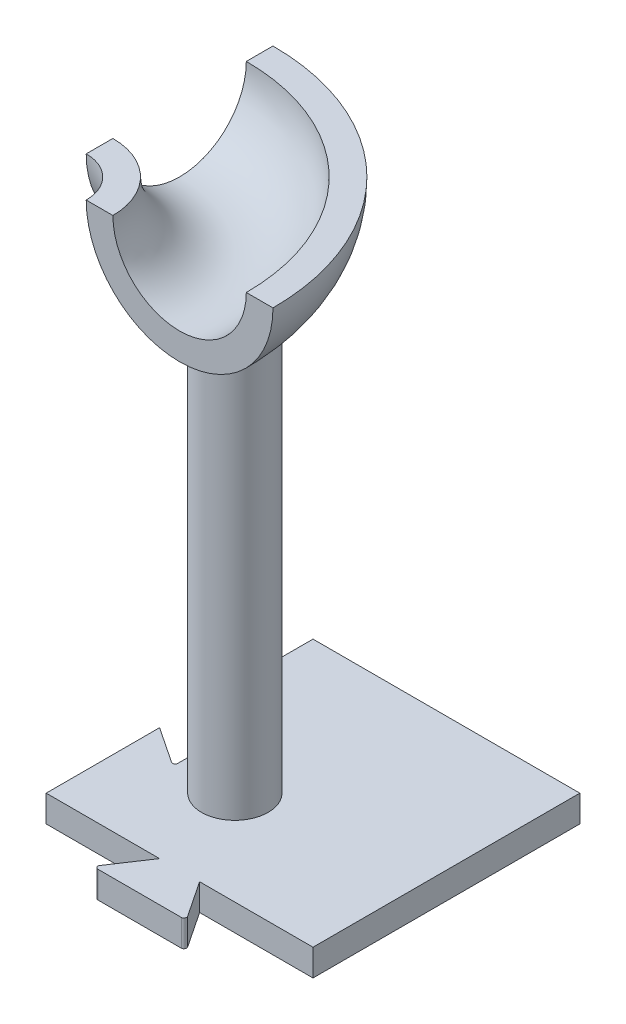
ISO-10303-21;
HEADER;
FILE_DESCRIPTION(('STEP AP214'),'2;1');
FILE_NAME('part.step','',(''),(''),'','','');
FILE_SCHEMA(('AUTOMOTIVE_DESIGN { 1 0 10303 214 1 1 1 1 }'));
ENDSEC;
DATA;
#1=APPLICATION_CONTEXT('core data for automotive mechanical design processes');
#2=APPLICATION_PROTOCOL_DEFINITION('international standard','automotive_design',2000,#1);
#3=PRODUCT_CONTEXT('',#1,'mechanical');
#4=PRODUCT('Part','Part','',(#3));
#5=PRODUCT_RELATED_PRODUCT_CATEGORY('part','',(#4));
#6=PRODUCT_DEFINITION_FORMATION('','',#4);
#7=PRODUCT_DEFINITION_CONTEXT('part definition',#1,'design');
#8=PRODUCT_DEFINITION('design','',#6,#7);
#9=PRODUCT_DEFINITION_SHAPE('','',#8);
#10=(LENGTH_UNIT() NAMED_UNIT(*) SI_UNIT(.MILLI.,.METRE.));
#11=(NAMED_UNIT(*) PLANE_ANGLE_UNIT() SI_UNIT($,.RADIAN.));
#12=(NAMED_UNIT(*) SI_UNIT($,.STERADIAN.) SOLID_ANGLE_UNIT());
#13=UNCERTAINTY_MEASURE_WITH_UNIT(LENGTH_MEASURE(1.E-05),#10,'distance_accuracy_value','');
#14=(GEOMETRIC_REPRESENTATION_CONTEXT(3) GLOBAL_UNCERTAINTY_ASSIGNED_CONTEXT((#13)) GLOBAL_UNIT_ASSIGNED_CONTEXT((#10,
#11,#12)) REPRESENTATION_CONTEXT('',''));
#15=CARTESIAN_POINT('',(0.,0.,0.));
#16=DIRECTION('',(0.,0.,1.));
#17=DIRECTION('',(1.,0.,0.));
#18=AXIS2_PLACEMENT_3D('',#15,#16,#17);
#19=CARTESIAN_POINT('',(-50.,10.,50.));
#20=DIRECTION('',(1.,0.,0.));
#21=DIRECTION('',(0.,0.,-1.));
#22=AXIS2_PLACEMENT_3D('',#19,#20,#21);
#23=PLANE('',#22);
#24=DIRECTION('',(0.,1.,0.));
#25=VECTOR('',#24,1.);
#26=CARTESIAN_POINT('',(-50.,-0.000999999999999265,7.49999999999999));
#27=LINE('',#26,#25);
#28=CARTESIAN_POINT('',(-50.,0.,7.50000000000001));
#29=VERTEX_POINT('',#28);
#30=CARTESIAN_POINT('',(-50.,10.,7.49999999999999));
#31=VERTEX_POINT('',#30);
#32=EDGE_CURVE('E200',#29,#31,#27,.T.);
#33=ORIENTED_EDGE('',*,*,#32,.F.);
#34=DIRECTION('',(0.,0.,1.));
#35=VECTOR('',#34,1.);
#36=CARTESIAN_POINT('',(-50.,0.,50.));
#37=LINE('',#36,#35);
#38=CARTESIAN_POINT('',(-50.,0.,50.));
#39=VERTEX_POINT('',#38);
#40=EDGE_CURVE('E206',#29,#39,#37,.T.);
#41=ORIENTED_EDGE('',*,*,#40,.T.);
#42=DIRECTION('',(0.,-1.,0.));
#43=VECTOR('',#42,1.);
#44=CARTESIAN_POINT('',(-50.,10.,50.));
#45=LINE('',#44,#43);
#46=CARTESIAN_POINT('',(-50.,10.,50.));
#47=VERTEX_POINT('',#46);
#48=EDGE_CURVE('E217',#47,#39,#45,.T.);
#49=ORIENTED_EDGE('',*,*,#48,.F.);
#50=DIRECTION('',(0.,0.,1.));
#51=VECTOR('',#50,1.);
#52=CARTESIAN_POINT('',(-50.,10.,50.));
#53=LINE('',#52,#51);
#54=EDGE_CURVE('E621',#31,#47,#53,.T.);
#55=ORIENTED_EDGE('',*,*,#54,.F.);
#56=EDGE_LOOP('',(#33,#41,#49,#55));
#57=FACE_BOUND('',#56,.T.);
#58=ADVANCED_FACE('F37',(#57),#23,.F.);
#59=CARTESIAN_POINT('',(0.,10.,0.));
#60=DIRECTION('',(0.,-1.,0.));
#61=DIRECTION('',(0.,0.,-1.));
#62=AXIS2_PLACEMENT_3D('',#59,#60,#61);
#63=PLANE('',#62);
#64=CARTESIAN_POINT('',(-14.6446609406726,10.,14.6446609406726));
#65=DIRECTION('',(0.,1.,0.));
#66=DIRECTION('',(0.,0.,1.));
#67=AXIS2_PLACEMENT_3D('',#64,#65,#66);
#68=CIRCLE('',#67,12.5);
#69=CARTESIAN_POINT('',(-14.6446609406726,10.,27.1446609406726));
#70=VERTEX_POINT('',#69);
#71=EDGE_CURVE('E228',#70,#70,#68,.T.);
#72=ORIENTED_EDGE('',*,*,#71,.F.);
#73=EDGE_LOOP('',(#72));
#74=FACE_BOUND('',#73,.T.);
#75=DIRECTION('',(0.832050294337844,0.,0.554700196225229));
#76=VECTOR('',#75,1.);
#77=CARTESIAN_POINT('',(-50.,10.,7.49999999999999));
#78=LINE('',#77,#76);
#79=CARTESIAN_POINT('',(-36.5547001962252,10.,16.4635332025165));
#80=VERTEX_POINT('',#79);
#81=EDGE_CURVE('E187',#31,#80,#78,.T.);
#82=ORIENTED_EDGE('',*,*,#81,.F.);
#83=ORIENTED_EDGE('',*,*,#54,.T.);
#84=DIRECTION('',(1.,0.,0.));
#85=VECTOR('',#84,1.);
#86=CARTESIAN_POINT('',(-50.,10.,50.));
#87=LINE('',#86,#85);
#88=CARTESIAN_POINT('',(-7.49999999999999,10.,50.));
#89=VERTEX_POINT('',#88);
#90=EDGE_CURVE('E218',#47,#89,#87,.T.);
#91=ORIENTED_EDGE('',*,*,#90,.T.);
#92=DIRECTION('',(-0.554700196225229,0.,0.832050294337844));
#93=VECTOR('',#92,1.);
#94=CARTESIAN_POINT('',(-7.49999999999999,10.,50.));
#95=LINE('',#94,#93);
#96=CARTESIAN_POINT('',(-16.4635332025165,10.,63.4452998037748));
#97=VERTEX_POINT('',#96);
#98=EDGE_CURVE('E628',#89,#97,#95,.T.);
#99=ORIENTED_EDGE('',*,*,#98,.T.);
#100=CARTESIAN_POINT('',(-15.6314829081787,10.,64.));
#101=DIRECTION('',(0.,-1.,0.));
#102=DIRECTION('',(0.,0.,-1.));
#103=AXIS2_PLACEMENT_3D('',#100,#101,#102);
#104=CIRCLE('',#103,1.);
#105=CARTESIAN_POINT('',(-15.6314829081787,10.,65.));
#106=VERTEX_POINT('',#105);
#107=EDGE_CURVE('E235',#97,#106,#104,.F.);
#108=ORIENTED_EDGE('',*,*,#107,.T.);
#109=DIRECTION('',(1.,0.,0.));
#110=VECTOR('',#109,1.);
#111=CARTESIAN_POINT('',(-17.5,10.,65.));
#112=LINE('',#111,#110);
#113=CARTESIAN_POINT('',(15.6314829081787,10.,65.));
#114=VERTEX_POINT('',#113);
#115=EDGE_CURVE('E627',#106,#114,#112,.T.);
#116=ORIENTED_EDGE('',*,*,#115,.T.);
#117=CARTESIAN_POINT('',(15.6314829081787,10.,64.));
#118=DIRECTION('',(0.,-1.,0.));
#119=DIRECTION('',(0.,0.,-1.));
#120=AXIS2_PLACEMENT_3D('',#117,#118,#119);
#121=CIRCLE('',#120,1.);
#122=CARTESIAN_POINT('',(16.4635332025165,10.,63.4452998037748));
#123=VERTEX_POINT('',#122);
#124=EDGE_CURVE('E227',#114,#123,#121,.F.);
#125=ORIENTED_EDGE('',*,*,#124,.T.);
#126=DIRECTION('',(-0.554700196225229,0.,-0.832050294337843));
#127=VECTOR('',#126,1.);
#128=CARTESIAN_POINT('',(17.5,10.,65.));
#129=LINE('',#128,#127);
#130=CARTESIAN_POINT('',(7.50000000000001,10.,50.));
#131=VERTEX_POINT('',#130);
#132=EDGE_CURVE('E338',#123,#131,#129,.T.);
#133=ORIENTED_EDGE('',*,*,#132,.T.);
#134=CARTESIAN_POINT('',(50.,10.,50.));
#135=VERTEX_POINT('',#134);
#136=EDGE_CURVE('E614',#131,#135,#87,.T.);
#137=ORIENTED_EDGE('',*,*,#136,.T.);
#138=DIRECTION('',(0.,0.,-1.));
#139=VECTOR('',#138,1.);
#140=CARTESIAN_POINT('',(50.,10.,50.));
#141=LINE('',#140,#139);
#142=CARTESIAN_POINT('',(50.,10.,-50.));
#143=VERTEX_POINT('',#142);
#144=EDGE_CURVE('E212',#135,#143,#141,.T.);
#145=ORIENTED_EDGE('',*,*,#144,.T.);
#146=DIRECTION('',(-1.,0.,0.));
#147=VECTOR('',#146,1.);
#148=CARTESIAN_POINT('',(-50.,10.,-50.));
#149=LINE('',#148,#147);
#150=CARTESIAN_POINT('',(-50.,10.,-50.));
#151=VERTEX_POINT('',#150);
#152=EDGE_CURVE('E624',#143,#151,#149,.T.);
#153=ORIENTED_EDGE('',*,*,#152,.T.);
#154=CARTESIAN_POINT('',(-50.,10.,-7.50000000000001));
#155=VERTEX_POINT('',#154);
#156=EDGE_CURVE('E625',#151,#155,#53,.T.);
#157=ORIENTED_EDGE('',*,*,#156,.T.);
#158=DIRECTION('',(-0.832050294337843,0.,0.554700196225229));
#159=VECTOR('',#158,1.);
#160=CARTESIAN_POINT('',(-35.,10.,-17.5));
#161=LINE('',#160,#159);
#162=CARTESIAN_POINT('',(-36.5547001962252,10.,-16.4635332025165));
#163=VERTEX_POINT('',#162);
#164=EDGE_CURVE('E194',#163,#155,#161,.T.);
#165=ORIENTED_EDGE('',*,*,#164,.F.);
#166=CARTESIAN_POINT('',(-36.,10.,-15.6314829081787));
#167=DIRECTION('',(0.,-1.,0.));
#168=DIRECTION('',(0.,0.,-1.));
#169=AXIS2_PLACEMENT_3D('',#166,#167,#168);
#170=CIRCLE('',#169,1.);
#171=CARTESIAN_POINT('',(-35.,10.,-15.6314829081787));
#172=VERTEX_POINT('',#171);
#173=EDGE_CURVE('E251',#163,#172,#170,.T.);
#174=ORIENTED_EDGE('',*,*,#173,.T.);
#175=DIRECTION('',(0.,0.,-1.));
#176=VECTOR('',#175,1.);
#177=CARTESIAN_POINT('',(-35.,10.,17.5));
#178=LINE('',#177,#176);
#179=CARTESIAN_POINT('',(-35.,10.,15.6314829081787));
#180=VERTEX_POINT('',#179);
#181=EDGE_CURVE('E260',#180,#172,#178,.T.);
#182=ORIENTED_EDGE('',*,*,#181,.F.);
#183=CARTESIAN_POINT('',(-36.,10.,15.6314829081787));
#184=DIRECTION('',(0.,-1.,0.));
#185=DIRECTION('',(0.,0.,-1.));
#186=AXIS2_PLACEMENT_3D('',#183,#184,#185);
#187=CIRCLE('',#186,1.);
#188=EDGE_CURVE('E48',#180,#80,#187,.T.);
#189=ORIENTED_EDGE('',*,*,#188,.T.);
#190=EDGE_LOOP('',(#82,#83,#91,#99,#108,#116,#125,#133,#137,#145,#153,#157,#165,#174,#182,#189));
#191=FACE_BOUND('',#190,.T.);
#192=ADVANCED_FACE('F258',(#74,#191),#63,.F.);
#193=CARTESIAN_POINT('',(0.,0.,0.));
#194=DIRECTION('',(0.,-1.,0.));
#195=DIRECTION('',(0.,0.,-1.));
#196=AXIS2_PLACEMENT_3D('',#193,#194,#195);
#197=PLANE('',#196);
#198=DIRECTION('',(0.832050294337844,0.,0.554700196225229));
#199=VECTOR('',#198,1.);
#200=CARTESIAN_POINT('',(-50.,0.,7.49999999999999));
#201=LINE('',#200,#199);
#202=CARTESIAN_POINT('',(-36.5547001962252,0.,16.4635332025165));
#203=VERTEX_POINT('',#202);
#204=EDGE_CURVE('E196',#29,#203,#201,.T.);
#205=ORIENTED_EDGE('',*,*,#204,.T.);
#206=CARTESIAN_POINT('',(-36.,0.,15.6314829081787));
#207=DIRECTION('',(0.,-1.,0.));
#208=DIRECTION('',(0.,0.,-1.));
#209=AXIS2_PLACEMENT_3D('',#206,#207,#208);
#210=CIRCLE('',#209,1.);
#211=CARTESIAN_POINT('',(-35.,0.,15.6314829081787));
#212=VERTEX_POINT('',#211);
#213=EDGE_CURVE('E11',#203,#212,#210,.F.);
#214=ORIENTED_EDGE('',*,*,#213,.T.);
#215=DIRECTION('',(0.,0.,-1.));
#216=VECTOR('',#215,1.);
#217=CARTESIAN_POINT('',(-35.,0.,17.5));
#218=LINE('',#217,#216);
#219=CARTESIAN_POINT('',(-35.,0.,-15.6314829081787));
#220=VERTEX_POINT('',#219);
#221=EDGE_CURVE('E189',#212,#220,#218,.T.);
#222=ORIENTED_EDGE('',*,*,#221,.T.);
#223=CARTESIAN_POINT('',(-36.,0.,-15.6314829081787));
#224=DIRECTION('',(0.,-1.,0.));
#225=DIRECTION('',(0.,0.,-1.));
#226=AXIS2_PLACEMENT_3D('',#223,#224,#225);
#227=CIRCLE('',#226,1.);
#228=CARTESIAN_POINT('',(-36.5547001962252,0.,-16.4635332025165));
#229=VERTEX_POINT('',#228);
#230=EDGE_CURVE('E181',#220,#229,#227,.F.);
#231=ORIENTED_EDGE('',*,*,#230,.T.);
#232=DIRECTION('',(-0.832050294337844,0.,0.554700196225229));
#233=VECTOR('',#232,1.);
#234=CARTESIAN_POINT('',(-35.,0.,-17.5));
#235=LINE('',#234,#233);
#236=CARTESIAN_POINT('',(-50.,0.,-7.49999999999999));
#237=VERTEX_POINT('',#236);
#238=EDGE_CURVE('E178',#229,#237,#235,.T.);
#239=ORIENTED_EDGE('',*,*,#238,.T.);
#240=CARTESIAN_POINT('',(-50.,0.,-50.));
#241=VERTEX_POINT('',#240);
#242=EDGE_CURVE('E179',#241,#237,#37,.T.);
#243=ORIENTED_EDGE('',*,*,#242,.F.);
#244=DIRECTION('',(-1.,0.,0.));
#245=VECTOR('',#244,1.);
#246=CARTESIAN_POINT('',(-50.,0.,-50.));
#247=LINE('',#246,#245);
#248=CARTESIAN_POINT('',(50.,0.,-50.));
#249=VERTEX_POINT('',#248);
#250=EDGE_CURVE('E209',#249,#241,#247,.T.);
#251=ORIENTED_EDGE('',*,*,#250,.F.);
#252=DIRECTION('',(0.,0.,-1.));
#253=VECTOR('',#252,1.);
#254=CARTESIAN_POINT('',(50.,0.,50.));
#255=LINE('',#254,#253);
#256=CARTESIAN_POINT('',(50.,0.,50.));
#257=VERTEX_POINT('',#256);
#258=EDGE_CURVE('E384',#257,#249,#255,.T.);
#259=ORIENTED_EDGE('',*,*,#258,.F.);
#260=DIRECTION('',(1.,0.,0.));
#261=VECTOR('',#260,1.);
#262=CARTESIAN_POINT('',(-50.,0.,50.));
#263=LINE('',#262,#261);
#264=CARTESIAN_POINT('',(7.50000000000001,0.,50.));
#265=VERTEX_POINT('',#264);
#266=EDGE_CURVE('E202',#265,#257,#263,.T.);
#267=ORIENTED_EDGE('',*,*,#266,.F.);
#268=DIRECTION('',(-0.554700196225229,0.,-0.832050294337843));
#269=VECTOR('',#268,1.);
#270=CARTESIAN_POINT('',(17.5,0.,65.));
#271=LINE('',#270,#269);
#272=CARTESIAN_POINT('',(16.4635332025165,0.,63.4452998037748));
#273=VERTEX_POINT('',#272);
#274=EDGE_CURVE('E324',#273,#265,#271,.T.);
#275=ORIENTED_EDGE('',*,*,#274,.F.);
#276=CARTESIAN_POINT('',(15.6314829081787,0.,64.));
#277=DIRECTION('',(0.,-1.,0.));
#278=DIRECTION('',(0.,0.,-1.));
#279=AXIS2_PLACEMENT_3D('',#276,#277,#278);
#280=CIRCLE('',#279,1.);
#281=CARTESIAN_POINT('',(15.6314829081787,0.,65.));
#282=VERTEX_POINT('',#281);
#283=EDGE_CURVE('E239',#273,#282,#280,.T.);
#284=ORIENTED_EDGE('',*,*,#283,.T.);
#285=DIRECTION('',(1.,0.,0.));
#286=VECTOR('',#285,1.);
#287=CARTESIAN_POINT('',(-17.5,0.,65.));
#288=LINE('',#287,#286);
#289=CARTESIAN_POINT('',(-15.6314829081787,0.,65.));
#290=VERTEX_POINT('',#289);
#291=EDGE_CURVE('E325',#290,#282,#288,.T.);
#292=ORIENTED_EDGE('',*,*,#291,.F.);
#293=CARTESIAN_POINT('',(-15.6314829081787,0.,64.));
#294=DIRECTION('',(0.,-1.,0.));
#295=DIRECTION('',(0.,0.,-1.));
#296=AXIS2_PLACEMENT_3D('',#293,#294,#295);
#297=CIRCLE('',#296,1.);
#298=CARTESIAN_POINT('',(-16.4635332025165,0.,63.4452998037748));
#299=VERTEX_POINT('',#298);
#300=EDGE_CURVE('E241',#290,#299,#297,.T.);
#301=ORIENTED_EDGE('',*,*,#300,.T.);
#302=DIRECTION('',(-0.554700196225229,0.,0.832050294337844));
#303=VECTOR('',#302,1.);
#304=CARTESIAN_POINT('',(-7.49999999999999,0.,50.));
#305=LINE('',#304,#303);
#306=CARTESIAN_POINT('',(-7.49999999999999,0.,50.));
#307=VERTEX_POINT('',#306);
#308=EDGE_CURVE('E332',#307,#299,#305,.T.);
#309=ORIENTED_EDGE('',*,*,#308,.F.);
#310=EDGE_CURVE('E208',#39,#307,#263,.T.);
#311=ORIENTED_EDGE('',*,*,#310,.F.);
#312=ORIENTED_EDGE('',*,*,#40,.F.);
#313=EDGE_LOOP('',(#205,#214,#222,#231,#239,#243,#251,#259,#267,#275,#284,#292,#301,#309,#311,#312));
#314=FACE_BOUND('',#313,.T.);
#315=ADVANCED_FACE('F176',(#314),#197,.T.);
#316=CARTESIAN_POINT('',(-50.,10.,50.));
#317=DIRECTION('',(0.,0.,-1.));
#318=DIRECTION('',(-1.,0.,0.));
#319=AXIS2_PLACEMENT_3D('',#316,#317,#318);
#320=PLANE('',#319);
#321=DIRECTION('',(0.,1.,0.));
#322=VECTOR('',#321,1.);
#323=CARTESIAN_POINT('',(7.50000000000001,-38.0788655293196,50.));
#324=LINE('',#323,#322);
#325=EDGE_CURVE('E334',#265,#131,#324,.T.);
#326=ORIENTED_EDGE('',*,*,#325,.F.);
#327=ORIENTED_EDGE('',*,*,#266,.T.);
#328=DIRECTION('',(0.,-1.,0.));
#329=VECTOR('',#328,1.);
#330=CARTESIAN_POINT('',(50.,10.,50.));
#331=LINE('',#330,#329);
#332=EDGE_CURVE('E214',#135,#257,#331,.T.);
#333=ORIENTED_EDGE('',*,*,#332,.F.);
#334=ORIENTED_EDGE('',*,*,#136,.F.);
#335=EDGE_LOOP('',(#326,#327,#333,#334));
#336=FACE_BOUND('',#335,.T.);
#337=ADVANCED_FACE('F296',(#336),#320,.F.);
#338=CARTESIAN_POINT('',(50.,10.,50.));
#339=DIRECTION('',(-1.,0.,0.));
#340=DIRECTION('',(0.,0.,1.));
#341=AXIS2_PLACEMENT_3D('',#338,#339,#340);
#342=PLANE('',#341);
#343=ORIENTED_EDGE('',*,*,#258,.T.);
#344=DIRECTION('',(0.,-1.,0.));
#345=VECTOR('',#344,1.);
#346=CARTESIAN_POINT('',(50.,10.,-50.));
#347=LINE('',#346,#345);
#348=EDGE_CURVE('E224',#143,#249,#347,.T.);
#349=ORIENTED_EDGE('',*,*,#348,.F.);
#350=ORIENTED_EDGE('',*,*,#144,.F.);
#351=ORIENTED_EDGE('',*,*,#332,.T.);
#352=EDGE_LOOP('',(#343,#349,#350,#351));
#353=FACE_BOUND('',#352,.T.);
#354=ADVANCED_FACE('F299',(#353),#342,.F.);
#355=CARTESIAN_POINT('',(-50.,10.,-50.));
#356=DIRECTION('',(0.,0.,1.));
#357=DIRECTION('',(1.,0.,0.));
#358=AXIS2_PLACEMENT_3D('',#355,#356,#357);
#359=PLANE('',#358);
#360=ORIENTED_EDGE('',*,*,#250,.T.);
#361=DIRECTION('',(0.,-1.,0.));
#362=VECTOR('',#361,1.);
#363=CARTESIAN_POINT('',(-50.,10.,-50.));
#364=LINE('',#363,#362);
#365=EDGE_CURVE('E204',#151,#241,#364,.T.);
#366=ORIENTED_EDGE('',*,*,#365,.F.);
#367=ORIENTED_EDGE('',*,*,#152,.F.);
#368=ORIENTED_EDGE('',*,*,#348,.T.);
#369=EDGE_LOOP('',(#360,#366,#367,#368));
#370=FACE_BOUND('',#369,.T.);
#371=ADVANCED_FACE('F289',(#370),#359,.F.);
#372=ORIENTED_EDGE('',*,*,#242,.T.);
#373=DIRECTION('',(0.,1.,0.));
#374=VECTOR('',#373,1.);
#375=CARTESIAN_POINT('',(-50.,-0.000999999999999265,-7.50000000000001));
#376=LINE('',#375,#374);
#377=EDGE_CURVE('E192',#237,#155,#376,.T.);
#378=ORIENTED_EDGE('',*,*,#377,.T.);
#379=ORIENTED_EDGE('',*,*,#156,.F.);
#380=ORIENTED_EDGE('',*,*,#365,.T.);
#381=EDGE_LOOP('',(#372,#378,#379,#380));
#382=FACE_BOUND('',#381,.T.);
#383=ADVANCED_FACE('F205',(#382),#23,.F.);
#384=ORIENTED_EDGE('',*,*,#310,.T.);
#385=DIRECTION('',(0.,1.,0.));
#386=VECTOR('',#385,1.);
#387=CARTESIAN_POINT('',(-7.49999999999999,-38.0788655293196,50.));
#388=LINE('',#387,#386);
#389=EDGE_CURVE('E343',#307,#89,#388,.T.);
#390=ORIENTED_EDGE('',*,*,#389,.T.);
#391=ORIENTED_EDGE('',*,*,#90,.F.);
#392=ORIENTED_EDGE('',*,*,#48,.T.);
#393=EDGE_LOOP('',(#384,#390,#391,#392));
#394=FACE_BOUND('',#393,.T.);
#395=ADVANCED_FACE('F287',(#394),#320,.F.);
#396=CARTESIAN_POINT('',(-14.6446609406726,210.002,14.6446609406726));
#397=DIRECTION('',(0.,-1.,0.));
#398=DIRECTION('',(0.,0.,-1.));
#399=AXIS2_PLACEMENT_3D('',#396,#397,#398);
#400=CYLINDRICAL_SURFACE('',#399,12.5);
#401=ORIENTED_EDGE('',*,*,#71,.T.);
#402=EDGE_LOOP('',(#401));
#403=FACE_BOUND('',#402,.T.);
#404=CARTESIAN_POINT('',(-23.4171735853589,175.037948119793,5.73999801056576));
#405=CARTESIAN_POINT('',(-23.6549821539822,175.02288081614,5.97427458832228));
#406=CARTESIAN_POINT('',(-23.883518184645,175.012162293418,6.218205165479));
#407=CARTESIAN_POINT('',(-24.3204137703477,174.999933275886,6.7237155227952));
#408=CARTESIAN_POINT('',(-24.5287750837902,174.998421977873,6.98529376142899));
#409=CARTESIAN_POINT('',(-24.9237228674926,175.004918642281,7.5240981204225));
#410=CARTESIAN_POINT('',(-25.1103195397615,175.01292212487,7.80131681828677));
#411=CARTESIAN_POINT('',(-25.4605539106761,175.038519578617,8.3694852223126));
#412=CARTESIAN_POINT('',(-25.6241909417061,175.056113828581,8.66043532742455));
#413=CARTESIAN_POINT('',(-25.9273450778984,175.100706500524,9.25374604095901));
#414=CARTESIAN_POINT('',(-26.0668749854686,175.127699907846,9.55610048836611));
#415=CARTESIAN_POINT('',(-26.3211014853385,175.190654236891,10.1701593228724));
#416=CARTESIAN_POINT('',(-26.4357982563274,175.226615094085,10.4818636426753));
#417=CARTESIAN_POINT('',(-26.639807352454,175.306809103864,11.1124789359798));
#418=CARTESIAN_POINT('',(-26.7291155236524,175.351043608177,11.4313910795811));
#419=CARTESIAN_POINT('',(-26.8819854311357,175.446824219771,12.074241433971));
#420=CARTESIAN_POINT('',(-26.9455466270321,175.498370480485,12.398179750103));
#421=CARTESIAN_POINT('',(-27.0476895029442,175.608562270204,13.0549127159419));
#422=CARTESIAN_POINT('',(-27.0858005580382,175.667318961922,13.3877617824363));
#423=CARTESIAN_POINT('',(-27.1351989005081,175.789672641898,14.0545481371708));
#424=CARTESIAN_POINT('',(-27.1464859476823,175.853269673495,14.3884854351291));
#425=CARTESIAN_POINT('',(-27.1423559857867,175.983625615879,15.0557467915407));
#426=CARTESIAN_POINT('',(-27.1269253755703,176.050386120263,15.3890704511293));
#427=CARTESIAN_POINT('',(-27.0695219125523,176.18513409859,16.0531805911711));
#428=CARTESIAN_POINT('',(-27.0275479126296,176.253121625437,16.3839669613453));
#429=CARTESIAN_POINT('',(-26.9138144834729,176.392495571282,17.061956347245));
#430=CARTESIAN_POINT('',(-26.8403503926615,176.463827376841,17.4088860925371));
#431=CARTESIAN_POINT('',(-26.6639563357701,176.602915447388,18.0961021961565));
#432=CARTESIAN_POINT('',(-26.5610117843221,176.670669922801,18.4363851767789));
#433=CARTESIAN_POINT('',(-26.3260718327317,176.799797545495,19.1079740195827));
#434=CARTESIAN_POINT('',(-26.1940813898387,176.86117177906,19.439281402802));
#435=CARTESIAN_POINT('',(-25.9016549037283,176.974773063654,20.0905219965808));
#436=CARTESIAN_POINT('',(-25.7412353391693,177.02700537903,20.4104616680396));
#437=CARTESIAN_POINT('',(-25.3954968204804,177.119057927835,21.0316663734431));
#438=CARTESIAN_POINT('',(-25.2106183371064,177.159063745298,21.3331485812127));
#439=CARTESIAN_POINT('',(-24.8151782991845,177.225710949246,21.9203637434979));
#440=CARTESIAN_POINT('',(-24.6046172352845,177.252352590995,22.206096998735));
#441=CARTESIAN_POINT('',(-24.1595766426953,177.290786953126,22.7589819874112));
#442=CARTESIAN_POINT('',(-23.9251171451544,177.30259200036,23.0261489718657));
#443=CARTESIAN_POINT('',(-23.434166698731,177.310714321674,23.5396446174646));
#444=CARTESIAN_POINT('',(-23.1776776298105,177.307032916055,23.7859750532067));
#445=CARTESIAN_POINT('',(-22.6721689637157,177.285559707248,24.2316760741475));
#446=CARTESIAN_POINT('',(-22.4250437504837,177.269241403714,24.4332746236219));
#447=CARTESIAN_POINT('',(-21.9168055840414,177.225044284459,24.8165436762202));
#448=CARTESIAN_POINT('',(-21.6556936362394,177.197166298715,24.9982156088754));
#449=CARTESIAN_POINT('',(-21.1212441991256,177.131051137342,25.3406719664219));
#450=CARTESIAN_POINT('',(-20.8479019778667,177.092809922688,25.5014482110784));
#451=CARTESIAN_POINT('',(-20.2908797659775,177.007538848074,25.8012855132398));
#452=CARTESIAN_POINT('',(-20.0071992571925,176.960508547117,25.9403454804739));
#453=CARTESIAN_POINT('',(-19.4248085837365,176.858323377611,26.1990523445776));
#454=CARTESIAN_POINT('',(-19.1259046172602,176.803011439502,26.3182002345909));
#455=CARTESIAN_POINT('',(-18.5206132763084,176.687062324177,26.5328973616781));
#456=CARTESIAN_POINT('',(-18.2142227291971,176.626422860004,26.6284363963765));
#457=CARTESIAN_POINT('',(-17.595538949562,176.501849799096,26.7955879870607));
#458=CARTESIAN_POINT('',(-17.2832438794683,176.437915165806,26.8671929604853));
#459=CARTESIAN_POINT('',(-16.6544651447109,176.308768984244,26.9861777926969));
#460=CARTESIAN_POINT('',(-16.3379830221728,176.243557902076,27.0335663290538));
#461=CARTESIAN_POINT('',(-15.6695447487874,176.107036612744,27.1075649727419));
#462=CARTESIAN_POINT('',(-15.3172815429789,176.035787355978,27.1315432800415));
#463=CARTESIAN_POINT('',(-14.6113723357424,175.896298186678,27.1496023562444));
#464=CARTESIAN_POINT('',(-14.2577262495779,175.828058461802,27.143681263432));
#465=CARTESIAN_POINT('',(-13.5512610527271,175.696675516404,27.1017743246286));
#466=CARTESIAN_POINT('',(-13.198441924165,175.633532184713,27.0657891346356));
#467=CARTESIAN_POINT('',(-12.495997080175,175.514162191288,26.9637190253439));
#468=CARTESIAN_POINT('',(-12.1463712625496,175.457935307481,26.8976350727811));
#469=CARTESIAN_POINT('',(-11.4539618295201,175.354089531356,26.7357909808303));
#470=CARTESIAN_POINT('',(-11.1111596848519,175.306443283961,26.6401278884578));
#471=CARTESIAN_POINT('',(-10.4338800458383,175.220726103405,26.4194715253652));
#472=CARTESIAN_POINT('',(-10.0994026138407,175.182655241941,26.2944780350489));
#473=CARTESIAN_POINT('',(-9.44161294460192,175.116950745694,26.0159325233857));
#474=CARTESIAN_POINT('',(-9.11829719379029,175.089313798707,25.8623895880872));
#475=CARTESIAN_POINT('',(-8.48545896173964,175.044959659927,25.5277819074594));
#476=CARTESIAN_POINT('',(-8.17593573751859,175.028241879271,25.3467186469307));
#477=CARTESIAN_POINT('',(-7.59175275024216,175.006554253414,24.970344625014));
#478=CARTESIAN_POINT('',(-7.31611844255872,175.00092870131,24.7765815290712));
#479=CARTESIAN_POINT('',(-6.78138293373921,174.999283333439,24.367427198037));
#480=CARTESIAN_POINT('',(-6.52228101108029,175.003263098175,24.1520369078786));
#481=CARTESIAN_POINT('',(-6.02248862565808,175.020450344872,23.7012277154507));
#482=CARTESIAN_POINT('',(-5.78179740562708,175.033657447069,23.4658096378049));
#483=CARTESIAN_POINT('',(-5.32047278259373,175.068718185673,22.9766796102884));
#484=CARTESIAN_POINT('',(-5.09983958898116,175.090571912331,22.7229674694919));
#485=CARTESIAN_POINT('',(-4.68216371001142,175.141919206725,22.2017160244485));
#486=CARTESIAN_POINT('',(-4.48490803401855,175.171334548911,21.9343395251184));
#487=CARTESIAN_POINT('',(-4.11264905675943,175.237049053758,21.3853376564954));
#488=CARTESIAN_POINT('',(-3.93764545554099,175.273348123611,21.1037124793427));
#489=CARTESIAN_POINT('',(-3.61084448977178,175.351881746136,20.5280656701834));
#490=CARTESIAN_POINT('',(-3.45904961235355,175.394116934014,20.2340427138863));
#491=CARTESIAN_POINT('',(-3.17947001089717,175.483499033025,19.6355039791562));
#492=CARTESIAN_POINT('',(-3.05168680649605,175.530646254733,19.3309875380596));
#493=CARTESIAN_POINT('',(-2.81605760831697,175.630783054768,18.7007533063694));
#494=CARTESIAN_POINT('',(-2.70923696190867,175.683932465235,18.3746773146125));
#495=CARTESIAN_POINT('',(-2.52284131416227,175.793151533429,17.7153085135024));
#496=CARTESIAN_POINT('',(-2.44326695187541,175.849221259616,17.3820155350723));
#497=CARTESIAN_POINT('',(-2.31175276794194,175.963036380085,16.7102239441482));
#498=CARTESIAN_POINT('',(-2.25981920241179,176.0207821506,16.3717241709901));
#499=CARTESIAN_POINT('',(-2.18388998350914,176.136675213116,15.6916795023969));
#500=CARTESIAN_POINT('',(-2.15989422217781,176.194822503563,15.350134618734));
#501=CARTESIAN_POINT('',(-2.13962709417297,176.31241625789,14.6533504421624));
#502=CARTESIAN_POINT('',(-2.14441996391621,176.371830617022,14.2980742347357));
#503=CARTESIAN_POINT('',(-2.18426813772818,176.488374208259,13.5888349698786));
#504=CARTESIAN_POINT('',(-2.21932429491764,176.545503375898,13.2348719497496));
#505=CARTESIAN_POINT('',(-2.31958561078665,176.65614577129,12.530658360442));
#506=CARTESIAN_POINT('',(-2.38479107596606,176.709658962277,12.1804078290421));
#507=CARTESIAN_POINT('',(-2.54506225516324,176.811800173083,11.4860774059773));
#508=CARTESIAN_POINT('',(-2.64012744224639,176.860428279088,11.1419974055344));
#509=CARTESIAN_POINT('',(-2.85889372795326,176.951316603076,10.4647729591495));
#510=CARTESIAN_POINT('',(-2.98239925697757,176.993617196233,10.1315708089706));
#511=CARTESIAN_POINT('',(-3.25768121234445,177.071197344647,9.47619797742736));
#512=CARTESIAN_POINT('',(-3.40945765466748,177.106476895935,9.15402730229888));
#513=CARTESIAN_POINT('',(-3.74027640945589,177.169117065514,8.5232899591689));
#514=CARTESIAN_POINT('',(-3.91931208008572,177.196479608122,8.21472000084324));
#515=CARTESIAN_POINT('',(-4.30343565290475,177.242589250224,7.61356723777163));
#516=CARTESIAN_POINT('',(-4.50852261567307,177.26133666027,7.3209838570866));
#517=CARTESIAN_POINT('',(-4.93472345767769,177.289169078381,6.76526369018378));
#518=CARTESIAN_POINT('',(-5.1548972752503,177.298603191964,6.50142287310174));
#519=CARTESIAN_POINT('',(-5.61631035729259,177.308831492125,5.99267812048045));
#520=CARTESIAN_POINT('',(-5.85754904873895,177.309625913654,5.7477736701607));
#521=CARTESIAN_POINT('',(-6.3592772678854,177.3025557368,5.27874735279469));
#522=CARTESIAN_POINT('',(-6.6197646847274,177.29469208657,5.05462321299308));
#523=CARTESIAN_POINT('',(-7.15805565191465,177.270501118319,4.62874753537503));
#524=CARTESIAN_POINT('',(-7.43585913132144,177.254173834968,4.42699590591483));
#525=CARTESIAN_POINT('',(-8.00101222311861,177.213859781979,4.05103912094035));
#526=CARTESIAN_POINT('',(-8.28806213540138,177.190031788579,3.87636595243268));
#527=CARTESIAN_POINT('',(-8.87474545101841,177.13517840303,3.55094204512382));
#528=CARTESIAN_POINT('',(-9.17437862863285,177.104153139942,3.40019087743911));
#529=CARTESIAN_POINT('',(-9.78417864569949,177.035601521277,3.12347040212154));
#530=CARTESIAN_POINT('',(-10.0943462575314,176.998074688178,2.99750291623595));
#531=CARTESIAN_POINT('',(-10.7231311339589,176.917344777436,2.77102282763157));
#532=CARTESIAN_POINT('',(-11.0417488754594,176.874141378874,2.67051166499773));
#533=CARTESIAN_POINT('',(-11.6931943661306,176.78187629799,2.49330117796948));
#534=CARTESIAN_POINT('',(-12.0261792538143,176.732697699889,2.41724037170605));
#535=CARTESIAN_POINT('',(-12.6966674860409,176.630437615766,2.29267336415443));
#536=CARTESIAN_POINT('',(-13.0341708820855,176.577356085228,2.24416747720947));
#537=CARTESIAN_POINT('',(-13.711607213291,176.468427022739,2.17488329563196));
#538=CARTESIAN_POINT('',(-14.0515404358445,176.412579158802,2.15410833737223));
#539=CARTESIAN_POINT('',(-14.7317096063467,176.299310848382,2.1403362429342));
#540=CARTESIAN_POINT('',(-15.0719455616631,176.241890362555,2.14733980237964));
#541=CARTESIAN_POINT('',(-15.7635518442185,176.124505730362,2.18983773535775));
#542=CARTESIAN_POINT('',(-16.1148544408869,176.064527782726,2.22640376491751));
#543=CARTESIAN_POINT('',(-16.8132732990059,175.94556943525,2.32915390788263));
#544=CARTESIAN_POINT('',(-17.1603895221179,175.886589044543,2.39533829231983));
#545=CARTESIAN_POINT('',(-17.8483305884216,175.770980096181,2.55700588184327));
#546=CARTESIAN_POINT('',(-18.189152143742,175.714352749302,2.65250396364619));
#547=CARTESIAN_POINT('',(-18.8620066940267,175.604859849397,2.87226685815202));
#548=CARTESIAN_POINT('',(-19.1940397293585,175.551994279091,2.99653153869784));
#549=CARTESIAN_POINT('',(-19.8806801761019,175.446183009786,3.28741458798374));
#550=CARTESIAN_POINT('',(-20.2340889249279,175.393790211447,3.45707753220915));
#551=CARTESIAN_POINT('',(-20.9242866980752,175.29695450238,3.82939082328234));
#552=CARTESIAN_POINT('',(-21.2610738187038,175.25251250074,4.03204493727091));
#553=CARTESIAN_POINT('',(-21.9146872003728,175.173215110583,4.46865486098408));
#554=CARTESIAN_POINT('',(-22.2315231075053,175.13835506148,4.70259537065083));
#555=CARTESIAN_POINT('',(-22.8422758200313,175.079623795493,5.19986796168193));
#556=CARTESIAN_POINT('',(-23.1361969348755,175.055750508231,5.46319449383038));
#557=CARTESIAN_POINT('',(-23.4171735853589,175.037948119793,5.73999801056576));
#558=B_SPLINE_CURVE_WITH_KNOTS('',3,(#404,#405,#406,#407,#408,#409,#410,#411,#412,#413,#414,
#415,#416,#417,#418,#419,#420,#421,#422,#423,#424,#425,#426,#427,#428,#429,#430,#431,#432,#433,
#434,#435,#436,#437,#438,#439,#440,#441,#442,#443,#444,#445,#446,#447,#448,#449,#450,#451,#452,
#453,#454,#455,#456,#457,#458,#459,#460,#461,#462,#463,#464,#465,#466,#467,#468,#469,#470,#471,
#472,#473,#474,#475,#476,#477,#478,#479,#480,#481,#482,#483,#484,#485,#486,#487,#488,#489,#490,
#491,#492,#493,#494,#495,#496,#497,#498,#499,#500,#501,#502,#503,#504,#505,#506,#507,#508,#509,
#510,#511,#512,#513,#514,#515,#516,#517,#518,#519,#520,#521,#522,#523,#524,#525,#526,#527,#528,
#529,#530,#531,#532,#533,#534,#535,#536,#537,#538,#539,#540,#541,#542,#543,#544,#545,#546,#547,
#548,#549,#550,#551,#552,#553,#554,#555,#556,#557),.UNSPECIFIED.,.T.,.F.,(4,2,2,2,2,2,2,2,2,2,2,
2,2,2,2,2,2,2,2,2,2,2,2,2,2,2,2,2,2,2,2,2,2,2,2,2,2,2,2,2,2,2,2,2,2,2,2,2,2,2,2,2,2,2,2,2,2,2,2,
2,2,2,2,2,2,2,2,2,2,2,2,2,2,2,2,2,4),(0.,1.00214438618167,2.00420134796692,3.00578669937641,
4.00740116864332,5.00848207125295,6.00955577025258,7.01079316513165,8.01205157331676,
9.03134731313205,10.05065218043,11.0704760973988,12.0903440909304,13.1742462881813,
14.2586856719496,15.3429401182701,16.4265681307023,17.4928215468699,18.5590545961939,
19.6244011885258,20.6896569563567,21.6465478343747,22.6033700202817,23.5605656614225,
24.5178093433572,25.4962852166797,26.4751831938672,27.4543910028886,28.4332476820983,
29.5125698882788,30.5919593003493,31.6713251607778,32.7506563557184,33.8264832593649,
34.9023182179684,35.9778113692621,37.0532465151957,38.0629372189161,39.0725838265227,
40.08218888306,41.0918044778583,42.0913687013709,43.090919449588,44.0905772383906,
45.090298271672,46.1307814538068,47.1712890384072,48.2120320276317,49.2527709951462,
50.3322142596317,51.4116879545684,52.4911726237475,53.5706382443275,54.6428916025408,
55.7151455668595,56.787138688461,57.8590931644943,58.889138558956,59.9191559420343,
60.9490605382622,61.9789609155714,62.9883803194794,63.9977816240538,65.0072570978996,
66.0167896658468,67.0508728576507,68.0849678459149,69.1191872373528,70.153432527656,
71.2269465207819,72.3004703376273,73.3745398716588,74.4486044713888,75.633327833976,
76.8181865707917,78.002467977892,79.1865261241571),.UNSPECIFIED.);
#559=CARTESIAN_POINT('',(-23.4171735853589,175.037948119793,5.73999801056576));
#560=VERTEX_POINT('',#559);
#561=EDGE_CURVE('E374',#560,#560,#558,.T.);
#562=ORIENTED_EDGE('',*,*,#561,.F.);
#563=EDGE_LOOP('',(#562));
#564=FACE_BOUND('',#563,.T.);
#565=ADVANCED_FACE('F294',(#403,#564),#400,.T.);
#566=CARTESIAN_POINT('',(-50.,210.,50.));
#567=DIRECTION('',(0.,1.,0.));
#568=DIRECTION('',(0.,0.,1.));
#569=AXIS2_PLACEMENT_3D('',#566,#567,#568);
#570=TOROIDAL_SURFACE('',#569,50.,35.);
#571=CARTESIAN_POINT('',(-50.,210.,50.));
#572=DIRECTION('',(0.,1.,0.));
#573=DIRECTION('',(1.,0.,0.));
#574=AXIS2_PLACEMENT_3D('',#571,#572,#573);
#575=CIRCLE('',#574,85.);
#576=CARTESIAN_POINT('',(35.,210.,50.));
#577=VERTEX_POINT('',#576);
#578=CARTESIAN_POINT('',(-50.,210.,-35.));
#579=VERTEX_POINT('',#578);
#580=EDGE_CURVE('E366',#577,#579,#575,.T.);
#581=ORIENTED_EDGE('',*,*,#580,.F.);
#582=CARTESIAN_POINT('',(0.,210.,50.));
#583=DIRECTION('',(0.,0.,1.));
#584=DIRECTION('',(-1.,0.,0.));
#585=AXIS2_PLACEMENT_3D('',#582,#583,#584);
#586=CIRCLE('',#585,35.);
#587=CARTESIAN_POINT('',(-35.,210.,50.));
#588=VERTEX_POINT('',#587);
#589=EDGE_CURVE('E359',#588,#577,#586,.T.);
#590=ORIENTED_EDGE('',*,*,#589,.F.);
#591=CARTESIAN_POINT('',(-50.,210.,50.));
#592=DIRECTION('',(0.,1.,0.));
#593=DIRECTION('',(1.,0.,0.));
#594=AXIS2_PLACEMENT_3D('',#591,#592,#593);
#595=CIRCLE('',#594,15.);
#596=CARTESIAN_POINT('',(-50.,210.,35.));
#597=VERTEX_POINT('',#596);
#598=EDGE_CURVE('E363',#588,#597,#595,.T.);
#599=ORIENTED_EDGE('',*,*,#598,.T.);
#600=CARTESIAN_POINT('',(-50.,210.,0.));
#601=DIRECTION('',(1.,0.,0.));
#602=DIRECTION('',(0.,0.,1.));
#603=AXIS2_PLACEMENT_3D('',#600,#601,#602);
#604=CIRCLE('',#603,35.);
#605=EDGE_CURVE('E365',#597,#579,#604,.T.);
#606=ORIENTED_EDGE('',*,*,#605,.T.);
#607=EDGE_LOOP('',(#581,#590,#599,#606));
#608=FACE_BOUND('',#607,.T.);
#609=ORIENTED_EDGE('',*,*,#561,.T.);
#610=EDGE_LOOP('',(#609));
#611=FACE_BOUND('',#610,.T.);
#612=ADVANCED_FACE('F394',(#608,#611),#570,.T.);
#613=CARTESIAN_POINT('',(0.,210.,50.));
#614=DIRECTION('',(0.,0.,-1.));
#615=DIRECTION('',(-1.,0.,0.));
#616=AXIS2_PLACEMENT_3D('',#613,#614,#615);
#617=PLANE('',#616);
#618=CARTESIAN_POINT('',(0.,210.,50.));
#619=DIRECTION('',(0.,0.,-1.));
#620=DIRECTION('',(-1.,0.,0.));
#621=AXIS2_PLACEMENT_3D('',#618,#619,#620);
#622=CIRCLE('',#621,25.);
#623=CARTESIAN_POINT('',(25.,210.,50.));
#624=VERTEX_POINT('',#623);
#625=CARTESIAN_POINT('',(-25.,210.,50.));
#626=VERTEX_POINT('',#625);
#627=EDGE_CURVE('E341',#624,#626,#622,.T.);
#628=ORIENTED_EDGE('',*,*,#627,.T.);
#629=DIRECTION('',(-1.,0.,0.));
#630=VECTOR('',#629,1.);
#631=CARTESIAN_POINT('',(-25.,210.,50.));
#632=LINE('',#631,#630);
#633=EDGE_CURVE('E347',#626,#588,#632,.T.);
#634=ORIENTED_EDGE('',*,*,#633,.T.);
#635=ORIENTED_EDGE('',*,*,#589,.T.);
#636=DIRECTION('',(-1.,0.,0.));
#637=VECTOR('',#636,1.);
#638=CARTESIAN_POINT('',(25.,210.,50.));
#639=LINE('',#638,#637);
#640=EDGE_CURVE('E357',#577,#624,#639,.T.);
#641=ORIENTED_EDGE('',*,*,#640,.T.);
#642=EDGE_LOOP('',(#628,#634,#635,#641));
#643=FACE_BOUND('',#642,.T.);
#644=ADVANCED_FACE('F388',(#643),#617,.F.);
#645=CARTESIAN_POINT('',(-50.,210.,0.));
#646=DIRECTION('',(-1.,0.,0.));
#647=DIRECTION('',(0.,0.,1.));
#648=AXIS2_PLACEMENT_3D('',#645,#646,#647);
#649=PLANE('',#648);
#650=CARTESIAN_POINT('',(-50.,210.,0.));
#651=DIRECTION('',(-1.,0.,0.));
#652=DIRECTION('',(0.,0.,1.));
#653=AXIS2_PLACEMENT_3D('',#650,#651,#652);
#654=CIRCLE('',#653,25.);
#655=CARTESIAN_POINT('',(-50.,210.,-25.));
#656=VERTEX_POINT('',#655);
#657=CARTESIAN_POINT('',(-50.,210.,25.));
#658=VERTEX_POINT('',#657);
#659=EDGE_CURVE('E350',#656,#658,#654,.T.);
#660=ORIENTED_EDGE('',*,*,#659,.F.);
#661=DIRECTION('',(0.,0.,1.));
#662=VECTOR('',#661,1.);
#663=CARTESIAN_POINT('',(-50.,210.,-25.));
#664=LINE('',#663,#662);
#665=EDGE_CURVE('E371',#579,#656,#664,.T.);
#666=ORIENTED_EDGE('',*,*,#665,.F.);
#667=ORIENTED_EDGE('',*,*,#605,.F.);
#668=DIRECTION('',(0.,0.,1.));
#669=VECTOR('',#668,1.);
#670=CARTESIAN_POINT('',(-50.,210.,25.));
#671=LINE('',#670,#669);
#672=EDGE_CURVE('E354',#658,#597,#671,.T.);
#673=ORIENTED_EDGE('',*,*,#672,.F.);
#674=EDGE_LOOP('',(#660,#666,#667,#673));
#675=FACE_BOUND('',#674,.T.);
#676=ADVANCED_FACE('F391',(#675),#649,.T.);
#677=CARTESIAN_POINT('',(-50.,210.,50.));
#678=DIRECTION('',(0.,1.,0.));
#679=DIRECTION('',(0.,0.,1.));
#680=AXIS2_PLACEMENT_3D('',#677,#678,#679);
#681=TOROIDAL_SURFACE('',#680,50.,25.);
#682=CARTESIAN_POINT('',(-50.,210.,50.));
#683=DIRECTION('',(0.,1.,0.));
#684=DIRECTION('',(1.,0.,0.));
#685=AXIS2_PLACEMENT_3D('',#682,#683,#684);
#686=CIRCLE('',#685,25.);
#687=EDGE_CURVE('E349',#626,#658,#686,.T.);
#688=ORIENTED_EDGE('',*,*,#687,.F.);
#689=ORIENTED_EDGE('',*,*,#627,.F.);
#690=CARTESIAN_POINT('',(-50.,210.,50.));
#691=DIRECTION('',(0.,1.,0.));
#692=DIRECTION('',(1.,0.,0.));
#693=AXIS2_PLACEMENT_3D('',#690,#691,#692);
#694=CIRCLE('',#693,75.);
#695=EDGE_CURVE('E348',#624,#656,#694,.T.);
#696=ORIENTED_EDGE('',*,*,#695,.T.);
#697=ORIENTED_EDGE('',*,*,#659,.T.);
#698=EDGE_LOOP('',(#688,#689,#696,#697));
#699=FACE_BOUND('',#698,.T.);
#700=ADVANCED_FACE('F397',(#699),#681,.F.);
#701=CARTESIAN_POINT('',(-25.,210.,50.));
#702=DIRECTION('',(0.,-1.,0.));
#703=DIRECTION('',(0.,0.,-1.));
#704=AXIS2_PLACEMENT_3D('',#701,#702,#703);
#705=PLANE('',#704);
#706=ORIENTED_EDGE('',*,*,#598,.F.);
#707=ORIENTED_EDGE('',*,*,#633,.F.);
#708=ORIENTED_EDGE('',*,*,#687,.T.);
#709=ORIENTED_EDGE('',*,*,#672,.T.);
#710=EDGE_LOOP('',(#706,#707,#708,#709));
#711=FACE_BOUND('',#710,.T.);
#712=ADVANCED_FACE('F404',(#711),#705,.F.);
#713=CARTESIAN_POINT('',(25.,210.,50.));
#714=DIRECTION('',(0.,-1.,0.));
#715=DIRECTION('',(0.,0.,-1.));
#716=AXIS2_PLACEMENT_3D('',#713,#714,#715);
#717=PLANE('',#716);
#718=ORIENTED_EDGE('',*,*,#665,.T.);
#719=ORIENTED_EDGE('',*,*,#695,.F.);
#720=ORIENTED_EDGE('',*,*,#640,.F.);
#721=ORIENTED_EDGE('',*,*,#580,.T.);
#722=EDGE_LOOP('',(#718,#719,#720,#721));
#723=FACE_BOUND('',#722,.T.);
#724=ADVANCED_FACE('F402',(#723),#717,.F.);
#725=CARTESIAN_POINT('',(-7.49999999999999,-38.0788655293196,50.));
#726=DIRECTION('',(-0.832050294337844,0.,-0.554700196225229));
#727=DIRECTION('',(-0.554700196225229,0.,0.832050294337844));
#728=AXIS2_PLACEMENT_3D('',#725,#726,#727);
#729=PLANE('',#728);
#730=ORIENTED_EDGE('',*,*,#308,.T.);
#731=DIRECTION('',(0.,1.,0.));
#732=VECTOR('',#731,1.);
#733=CARTESIAN_POINT('',(-16.4635332025165,-38.0788655293196,63.4452998037748));
#734=LINE('',#733,#732);
#735=EDGE_CURVE('E230',#299,#97,#734,.T.);
#736=ORIENTED_EDGE('',*,*,#735,.T.);
#737=ORIENTED_EDGE('',*,*,#98,.F.);
#738=ORIENTED_EDGE('',*,*,#389,.F.);
#739=EDGE_LOOP('',(#730,#736,#737,#738));
#740=FACE_BOUND('',#739,.T.);
#741=ADVANCED_FACE('F398',(#740),#729,.T.);
#742=CARTESIAN_POINT('',(-17.5,-38.0788655293196,65.));
#743=DIRECTION('',(0.,0.,1.));
#744=DIRECTION('',(1.,0.,0.));
#745=AXIS2_PLACEMENT_3D('',#742,#743,#744);
#746=PLANE('',#745);
#747=ORIENTED_EDGE('',*,*,#115,.F.);
#748=DIRECTION('',(0.,1.,0.));
#749=VECTOR('',#748,1.);
#750=CARTESIAN_POINT('',(-15.6314829081787,-38.0788655293196,65.));
#751=LINE('',#750,#749);
#752=EDGE_CURVE('E240',#106,#290,#751,.F.);
#753=ORIENTED_EDGE('',*,*,#752,.T.);
#754=ORIENTED_EDGE('',*,*,#291,.T.);
#755=DIRECTION('',(0.,1.,0.));
#756=VECTOR('',#755,1.);
#757=CARTESIAN_POINT('',(15.6314829081787,-38.0788655293196,65.));
#758=LINE('',#757,#756);
#759=EDGE_CURVE('E232',#282,#114,#758,.T.);
#760=ORIENTED_EDGE('',*,*,#759,.T.);
#761=EDGE_LOOP('',(#747,#753,#754,#760));
#762=FACE_BOUND('',#761,.T.);
#763=ADVANCED_FACE('F327',(#762),#746,.T.);
#764=CARTESIAN_POINT('',(17.5,-38.0788655293196,65.));
#765=DIRECTION('',(0.832050294337843,0.,-0.554700196225229));
#766=DIRECTION('',(-0.554700196225229,0.,-0.832050294337843));
#767=AXIS2_PLACEMENT_3D('',#764,#765,#766);
#768=PLANE('',#767);
#769=ORIENTED_EDGE('',*,*,#132,.F.);
#770=DIRECTION('',(0.,1.,0.));
#771=VECTOR('',#770,1.);
#772=CARTESIAN_POINT('',(16.4635332025165,-38.0788655293196,63.4452998037748));
#773=LINE('',#772,#771);
#774=EDGE_CURVE('E244',#123,#273,#773,.F.);
#775=ORIENTED_EDGE('',*,*,#774,.T.);
#776=ORIENTED_EDGE('',*,*,#274,.T.);
#777=ORIENTED_EDGE('',*,*,#325,.T.);
#778=EDGE_LOOP('',(#769,#775,#776,#777));
#779=FACE_BOUND('',#778,.T.);
#780=ADVANCED_FACE('F309',(#779),#768,.T.);
#781=CARTESIAN_POINT('',(-15.6314829081787,-38.0788655293196,64.));
#782=DIRECTION('',(0.,1.,0.));
#783=DIRECTION('',(0.,0.,1.));
#784=AXIS2_PLACEMENT_3D('',#781,#782,#783);
#785=CYLINDRICAL_SURFACE('',#784,1.);
#786=ORIENTED_EDGE('',*,*,#300,.F.);
#787=ORIENTED_EDGE('',*,*,#752,.F.);
#788=ORIENTED_EDGE('',*,*,#107,.F.);
#789=ORIENTED_EDGE('',*,*,#735,.F.);
#790=EDGE_LOOP('',(#786,#787,#788,#789));
#791=FACE_BOUND('',#790,.T.);
#792=ADVANCED_FACE('F307',(#791),#785,.T.);
#793=CARTESIAN_POINT('',(15.6314829081787,-38.0788655293196,64.));
#794=DIRECTION('',(0.,1.,0.));
#795=DIRECTION('',(0.,0.,1.));
#796=AXIS2_PLACEMENT_3D('',#793,#794,#795);
#797=CYLINDRICAL_SURFACE('',#796,1.);
#798=ORIENTED_EDGE('',*,*,#283,.F.);
#799=ORIENTED_EDGE('',*,*,#774,.F.);
#800=ORIENTED_EDGE('',*,*,#124,.F.);
#801=ORIENTED_EDGE('',*,*,#759,.F.);
#802=EDGE_LOOP('',(#798,#799,#800,#801));
#803=FACE_BOUND('',#802,.T.);
#804=ADVANCED_FACE('F310',(#803),#797,.T.);
#805=CARTESIAN_POINT('',(-35.,-0.000999999999999265,-17.5));
#806=DIRECTION('',(-0.554700196225229,0.,-0.832050294337843));
#807=DIRECTION('',(-0.832050294337844,0.,0.554700196225229));
#808=AXIS2_PLACEMENT_3D('',#805,#806,#807);
#809=PLANE('',#808);
#810=ORIENTED_EDGE('',*,*,#238,.F.);
#811=DIRECTION('',(0.,1.,0.));
#812=VECTOR('',#811,1.);
#813=CARTESIAN_POINT('',(-36.5547001962252,10.,-16.4635332025165));
#814=LINE('',#813,#812);
#815=EDGE_CURVE('E245',#229,#163,#814,.T.);
#816=ORIENTED_EDGE('',*,*,#815,.T.);
#817=ORIENTED_EDGE('',*,*,#164,.T.);
#818=ORIENTED_EDGE('',*,*,#377,.F.);
#819=EDGE_LOOP('',(#810,#816,#817,#818));
#820=FACE_BOUND('',#819,.T.);
#821=ADVANCED_FACE('F195',(#820),#809,.F.);
#822=CARTESIAN_POINT('',(-35.,-0.000999999999999265,17.5));
#823=DIRECTION('',(1.,0.,0.));
#824=DIRECTION('',(0.,0.,-1.));
#825=AXIS2_PLACEMENT_3D('',#822,#823,#824);
#826=PLANE('',#825);
#827=ORIENTED_EDGE('',*,*,#181,.T.);
#828=DIRECTION('',(0.,1.,0.));
#829=VECTOR('',#828,1.);
#830=CARTESIAN_POINT('',(-35.,0.,-15.6314829081787));
#831=LINE('',#830,#829);
#832=EDGE_CURVE('E246',#172,#220,#831,.F.);
#833=ORIENTED_EDGE('',*,*,#832,.T.);
#834=ORIENTED_EDGE('',*,*,#221,.F.);
#835=DIRECTION('',(0.,1.,0.));
#836=VECTOR('',#835,1.);
#837=CARTESIAN_POINT('',(-35.,10.,15.6314829081787));
#838=LINE('',#837,#836);
#839=EDGE_CURVE('E250',#212,#180,#838,.T.);
#840=ORIENTED_EDGE('',*,*,#839,.T.);
#841=EDGE_LOOP('',(#827,#833,#834,#840));
#842=FACE_BOUND('',#841,.T.);
#843=ADVANCED_FACE('F261',(#842),#826,.F.);
#844=CARTESIAN_POINT('',(-50.,-0.000999999999999265,7.49999999999999));
#845=DIRECTION('',(-0.554700196225229,0.,0.832050294337844));
#846=DIRECTION('',(0.832050294337844,0.,0.554700196225229));
#847=AXIS2_PLACEMENT_3D('',#844,#845,#846);
#848=PLANE('',#847);
#849=ORIENTED_EDGE('',*,*,#81,.T.);
#850=DIRECTION('',(0.,1.,0.));
#851=VECTOR('',#850,1.);
#852=CARTESIAN_POINT('',(-36.5547001962252,0.,16.4635332025165));
#853=LINE('',#852,#851);
#854=EDGE_CURVE('E54',#80,#203,#853,.F.);
#855=ORIENTED_EDGE('',*,*,#854,.T.);
#856=ORIENTED_EDGE('',*,*,#204,.F.);
#857=ORIENTED_EDGE('',*,*,#32,.T.);
#858=EDGE_LOOP('',(#849,#855,#856,#857));
#859=FACE_BOUND('',#858,.T.);
#860=ADVANCED_FACE('F270',(#859),#848,.F.);
#861=CARTESIAN_POINT('',(-36.,-0.000999999999999265,-15.6314829081787));
#862=DIRECTION('',(0.,-1.,0.));
#863=DIRECTION('',(0.,0.,-1.));
#864=AXIS2_PLACEMENT_3D('',#861,#862,#863);
#865=CYLINDRICAL_SURFACE('',#864,1.);
#866=ORIENTED_EDGE('',*,*,#230,.F.);
#867=ORIENTED_EDGE('',*,*,#832,.F.);
#868=ORIENTED_EDGE('',*,*,#173,.F.);
#869=ORIENTED_EDGE('',*,*,#815,.F.);
#870=EDGE_LOOP('',(#866,#867,#868,#869));
#871=FACE_BOUND('',#870,.T.);
#872=ADVANCED_FACE('F264',(#871),#865,.F.);
#873=CARTESIAN_POINT('',(-36.,-0.000999999999999265,15.6314829081787));
#874=DIRECTION('',(0.,-1.,0.));
#875=DIRECTION('',(0.,0.,-1.));
#876=AXIS2_PLACEMENT_3D('',#873,#874,#875);
#877=CYLINDRICAL_SURFACE('',#876,1.);
#878=ORIENTED_EDGE('',*,*,#213,.F.);
#879=ORIENTED_EDGE('',*,*,#854,.F.);
#880=ORIENTED_EDGE('',*,*,#188,.F.);
#881=ORIENTED_EDGE('',*,*,#839,.F.);
#882=EDGE_LOOP('',(#878,#879,#880,#881));
#883=FACE_BOUND('',#882,.T.);
#884=ADVANCED_FACE('F45',(#883),#877,.F.);
#885=CLOSED_SHELL('',(#58,#192,#315,#337,#354,#371,#383,#395,#565,#612,#644,#676,#700,#712,#724,
#741,#763,#780,#792,#804,#821,#843,#860,#872,#884));
#886=MANIFOLD_SOLID_BREP('B2',#885);
#887=ADVANCED_BREP_SHAPE_REPRESENTATION('',(#18,#886),#14);
#888=SHAPE_DEFINITION_REPRESENTATION(#9,#887);
ENDSEC;
END-ISO-10303-21;
